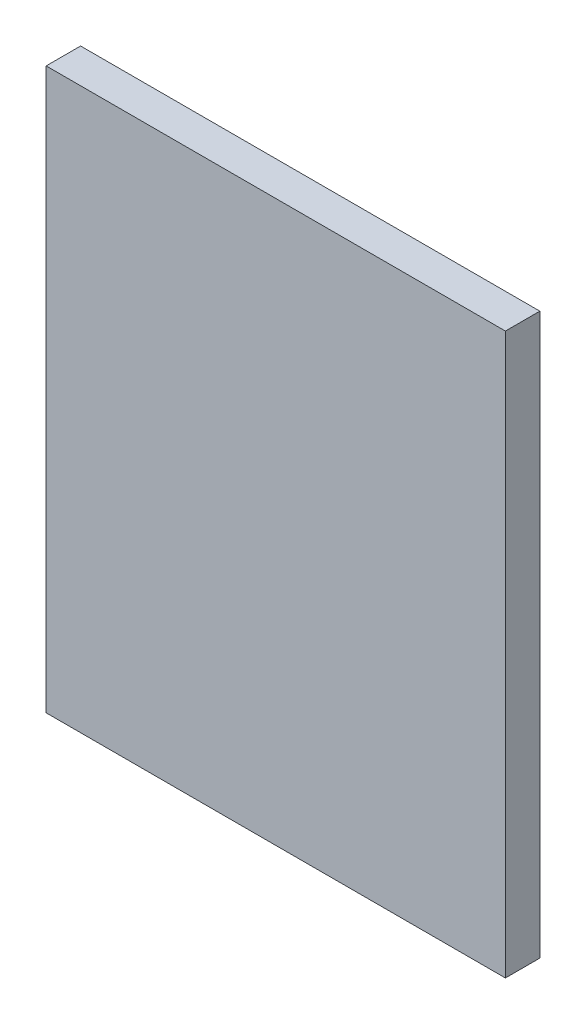
ISO-10303-21;
HEADER;
FILE_DESCRIPTION(('STEP AP214'),'2;1');
FILE_NAME('part.step','',(''),(''),'','','');
FILE_SCHEMA(('AUTOMOTIVE_DESIGN { 1 0 10303 214 1 1 1 1 }'));
ENDSEC;
DATA;
#1=APPLICATION_CONTEXT('core data for automotive mechanical design processes');
#2=APPLICATION_PROTOCOL_DEFINITION('international standard','automotive_design',2000,#1);
#3=PRODUCT_CONTEXT('',#1,'mechanical');
#4=PRODUCT('Part','Part','',(#3));
#5=PRODUCT_RELATED_PRODUCT_CATEGORY('part','',(#4));
#6=PRODUCT_DEFINITION_FORMATION('','',#4);
#7=PRODUCT_DEFINITION_CONTEXT('part definition',#1,'design');
#8=PRODUCT_DEFINITION('design','',#6,#7);
#9=PRODUCT_DEFINITION_SHAPE('','',#8);
#10=(LENGTH_UNIT() NAMED_UNIT(*) SI_UNIT(.MILLI.,.METRE.));
#11=(NAMED_UNIT(*) PLANE_ANGLE_UNIT() SI_UNIT($,.RADIAN.));
#12=(NAMED_UNIT(*) SI_UNIT($,.STERADIAN.) SOLID_ANGLE_UNIT());
#13=UNCERTAINTY_MEASURE_WITH_UNIT(LENGTH_MEASURE(1.E-05),#10,'distance_accuracy_value','');
#14=(GEOMETRIC_REPRESENTATION_CONTEXT(3) GLOBAL_UNCERTAINTY_ASSIGNED_CONTEXT((#13)) GLOBAL_UNIT_ASSIGNED_CONTEXT((#10,
#11,#12)) REPRESENTATION_CONTEXT('',''));
#15=CARTESIAN_POINT('',(0.,0.,0.));
#16=DIRECTION('',(0.,0.,1.));
#17=DIRECTION('',(1.,0.,0.));
#18=AXIS2_PLACEMENT_3D('',#15,#16,#17);
#19=CARTESIAN_POINT('',(0.,0.,15.));
#20=DIRECTION('',(0.,1.,0.));
#21=DIRECTION('',(0.,0.,1.));
#22=AXIS2_PLACEMENT_3D('',#19,#20,#21);
#23=PLANE('',#22);
#24=DIRECTION('',(1.,0.,0.));
#25=VECTOR('',#24,1.);
#26=CARTESIAN_POINT('',(0.,0.,0.));
#27=LINE('',#26,#25);
#28=CARTESIAN_POINT('',(-200.,0.,0.));
#29=VERTEX_POINT('',#28);
#30=CARTESIAN_POINT('',(0.,0.,0.));
#31=VERTEX_POINT('',#30);
#32=EDGE_CURVE('E113',#29,#31,#27,.T.);
#33=ORIENTED_EDGE('',*,*,#32,.T.);
#34=DIRECTION('',(0.,0.,-1.));
#35=VECTOR('',#34,1.);
#36=CARTESIAN_POINT('',(0.,0.,15.));
#37=LINE('',#36,#35);
#38=CARTESIAN_POINT('',(0.,0.,15.));
#39=VERTEX_POINT('',#38);
#40=EDGE_CURVE('E11',#39,#31,#37,.T.);
#41=ORIENTED_EDGE('',*,*,#40,.F.);
#42=DIRECTION('',(1.,0.,0.));
#43=VECTOR('',#42,1.);
#44=CARTESIAN_POINT('',(0.,0.,15.));
#45=LINE('',#44,#43);
#46=CARTESIAN_POINT('',(-200.,0.,15.));
#47=VERTEX_POINT('',#46);
#48=EDGE_CURVE('E97',#47,#39,#45,.T.);
#49=ORIENTED_EDGE('',*,*,#48,.F.);
#50=DIRECTION('',(0.,0.,-1.));
#51=VECTOR('',#50,1.);
#52=CARTESIAN_POINT('',(-200.,0.,15.));
#53=LINE('',#52,#51);
#54=EDGE_CURVE('E109',#47,#29,#53,.T.);
#55=ORIENTED_EDGE('',*,*,#54,.T.);
#56=EDGE_LOOP('',(#33,#41,#49,#55));
#57=FACE_BOUND('',#56,.T.);
#58=ADVANCED_FACE('F45',(#57),#23,.F.);
#59=CARTESIAN_POINT('',(0.,0.,15.));
#60=DIRECTION('',(-1.,0.,0.));
#61=DIRECTION('',(0.,0.,1.));
#62=AXIS2_PLACEMENT_3D('',#59,#60,#61);
#63=PLANE('',#62);
#64=DIRECTION('',(0.,1.,0.));
#65=VECTOR('',#64,1.);
#66=CARTESIAN_POINT('',(0.,0.,0.));
#67=LINE('',#66,#65);
#68=CARTESIAN_POINT('',(0.,244.,0.));
#69=VERTEX_POINT('',#68);
#70=EDGE_CURVE('E102',#31,#69,#67,.T.);
#71=ORIENTED_EDGE('',*,*,#70,.T.);
#72=DIRECTION('',(0.,0.,-1.));
#73=VECTOR('',#72,1.);
#74=CARTESIAN_POINT('',(0.,244.,15.));
#75=LINE('',#74,#73);
#76=CARTESIAN_POINT('',(0.,244.,15.));
#77=VERTEX_POINT('',#76);
#78=EDGE_CURVE('E54',#77,#69,#75,.T.);
#79=ORIENTED_EDGE('',*,*,#78,.F.);
#80=DIRECTION('',(0.,1.,0.));
#81=VECTOR('',#80,1.);
#82=CARTESIAN_POINT('',(0.,0.,15.));
#83=LINE('',#82,#81);
#84=EDGE_CURVE('E92',#39,#77,#83,.T.);
#85=ORIENTED_EDGE('',*,*,#84,.F.);
#86=ORIENTED_EDGE('',*,*,#40,.T.);
#87=EDGE_LOOP('',(#71,#79,#85,#86));
#88=FACE_BOUND('',#87,.T.);
#89=ADVANCED_FACE('F101',(#88),#63,.F.);
#90=CARTESIAN_POINT('',(0.,244.,15.));
#91=DIRECTION('',(0.,-1.,0.));
#92=DIRECTION('',(0.,0.,-1.));
#93=AXIS2_PLACEMENT_3D('',#90,#91,#92);
#94=PLANE('',#93);
#95=DIRECTION('',(-1.,0.,0.));
#96=VECTOR('',#95,1.);
#97=CARTESIAN_POINT('',(0.,244.,0.));
#98=LINE('',#97,#96);
#99=CARTESIAN_POINT('',(-200.,244.,0.));
#100=VERTEX_POINT('',#99);
#101=EDGE_CURVE('E79',#69,#100,#98,.T.);
#102=ORIENTED_EDGE('',*,*,#101,.T.);
#103=DIRECTION('',(0.,0.,-1.));
#104=VECTOR('',#103,1.);
#105=CARTESIAN_POINT('',(-200.,244.,15.));
#106=LINE('',#105,#104);
#107=CARTESIAN_POINT('',(-200.,244.,15.));
#108=VERTEX_POINT('',#107);
#109=EDGE_CURVE('E104',#108,#100,#106,.T.);
#110=ORIENTED_EDGE('',*,*,#109,.F.);
#111=DIRECTION('',(-1.,0.,0.));
#112=VECTOR('',#111,1.);
#113=CARTESIAN_POINT('',(0.,244.,15.));
#114=LINE('',#113,#112);
#115=EDGE_CURVE('E95',#77,#108,#114,.T.);
#116=ORIENTED_EDGE('',*,*,#115,.F.);
#117=ORIENTED_EDGE('',*,*,#78,.T.);
#118=EDGE_LOOP('',(#102,#110,#116,#117));
#119=FACE_BOUND('',#118,.T.);
#120=ADVANCED_FACE('F105',(#119),#94,.F.);
#121=CARTESIAN_POINT('',(-200.,0.,15.));
#122=DIRECTION('',(1.,0.,0.));
#123=DIRECTION('',(0.,0.,-1.));
#124=AXIS2_PLACEMENT_3D('',#121,#122,#123);
#125=PLANE('',#124);
#126=DIRECTION('',(0.,-1.,0.));
#127=VECTOR('',#126,1.);
#128=CARTESIAN_POINT('',(-200.,0.,0.));
#129=LINE('',#128,#127);
#130=EDGE_CURVE('E85',#100,#29,#129,.T.);
#131=ORIENTED_EDGE('',*,*,#130,.T.);
#132=ORIENTED_EDGE('',*,*,#54,.F.);
#133=DIRECTION('',(0.,-1.,0.));
#134=VECTOR('',#133,1.);
#135=CARTESIAN_POINT('',(-200.,0.,15.));
#136=LINE('',#135,#134);
#137=EDGE_CURVE('E62',#108,#47,#136,.T.);
#138=ORIENTED_EDGE('',*,*,#137,.F.);
#139=ORIENTED_EDGE('',*,*,#109,.T.);
#140=EDGE_LOOP('',(#131,#132,#138,#139));
#141=FACE_BOUND('',#140,.T.);
#142=ADVANCED_FACE('F126',(#141),#125,.F.);
#143=CARTESIAN_POINT('',(0.,0.,15.));
#144=DIRECTION('',(0.,0.,-1.));
#145=DIRECTION('',(-1.,0.,0.));
#146=AXIS2_PLACEMENT_3D('',#143,#144,#145);
#147=PLANE('',#146);
#148=ORIENTED_EDGE('',*,*,#48,.T.);
#149=ORIENTED_EDGE('',*,*,#84,.T.);
#150=ORIENTED_EDGE('',*,*,#115,.T.);
#151=ORIENTED_EDGE('',*,*,#137,.T.);
#152=EDGE_LOOP('',(#148,#149,#150,#151));
#153=FACE_BOUND('',#152,.T.);
#154=ADVANCED_FACE('F93',(#153),#147,.F.);
#155=CARTESIAN_POINT('',(0.,0.,0.));
#156=DIRECTION('',(0.,0.,-1.));
#157=DIRECTION('',(-1.,0.,0.));
#158=AXIS2_PLACEMENT_3D('',#155,#156,#157);
#159=PLANE('',#158);
#160=ORIENTED_EDGE('',*,*,#32,.F.);
#161=ORIENTED_EDGE('',*,*,#130,.F.);
#162=ORIENTED_EDGE('',*,*,#101,.F.);
#163=ORIENTED_EDGE('',*,*,#70,.F.);
#164=EDGE_LOOP('',(#160,#161,#162,#163));
#165=FACE_BOUND('',#164,.T.);
#166=ADVANCED_FACE('F129',(#165),#159,.T.);
#167=CLOSED_SHELL('',(#58,#89,#120,#142,#154,#166));
#168=MANIFOLD_SOLID_BREP('B2',#167);
#169=ADVANCED_BREP_SHAPE_REPRESENTATION('',(#18,#168),#14);
#170=SHAPE_DEFINITION_REPRESENTATION(#9,#169);
ENDSEC;
END-ISO-10303-21;
